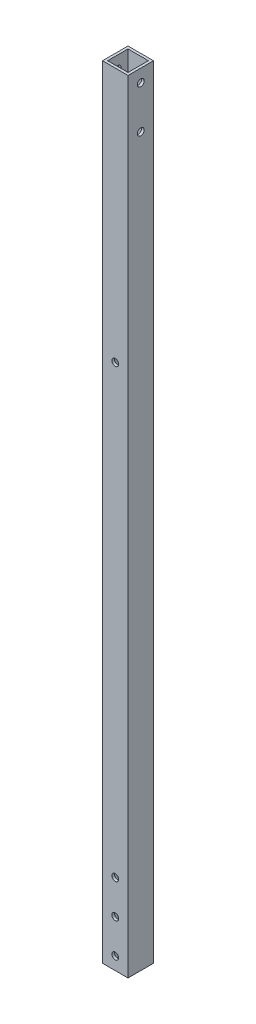
ISO-10303-21;
HEADER;
FILE_DESCRIPTION(('STEP AP214'),'2;1');
FILE_NAME('part.step','',(''),(''),'','','');
FILE_SCHEMA(('AUTOMOTIVE_DESIGN { 1 0 10303 214 1 1 1 1 }'));
ENDSEC;
DATA;
#1=APPLICATION_CONTEXT('core data for automotive mechanical design processes');
#2=APPLICATION_PROTOCOL_DEFINITION('international standard','automotive_design',2000,#1);
#3=PRODUCT_CONTEXT('',#1,'mechanical');
#4=PRODUCT('Part','Part','',(#3));
#5=PRODUCT_RELATED_PRODUCT_CATEGORY('part','',(#4));
#6=PRODUCT_DEFINITION_FORMATION('','',#4);
#7=PRODUCT_DEFINITION_CONTEXT('part definition',#1,'design');
#8=PRODUCT_DEFINITION('design','',#6,#7);
#9=PRODUCT_DEFINITION_SHAPE('','',#8);
#10=(LENGTH_UNIT() NAMED_UNIT(*) SI_UNIT(.MILLI.,.METRE.));
#11=(NAMED_UNIT(*) PLANE_ANGLE_UNIT() SI_UNIT($,.RADIAN.));
#12=(NAMED_UNIT(*) SI_UNIT($,.STERADIAN.) SOLID_ANGLE_UNIT());
#13=UNCERTAINTY_MEASURE_WITH_UNIT(LENGTH_MEASURE(1.E-05),#10,'distance_accuracy_value','');
#14=(GEOMETRIC_REPRESENTATION_CONTEXT(3) GLOBAL_UNCERTAINTY_ASSIGNED_CONTEXT((#13)) GLOBAL_UNIT_ASSIGNED_CONTEXT((#10,
#11,#12)) REPRESENTATION_CONTEXT('',''));
#15=CARTESIAN_POINT('',(0.,0.,0.));
#16=DIRECTION('',(0.,0.,1.));
#17=DIRECTION('',(1.,0.,0.));
#18=AXIS2_PLACEMENT_3D('',#15,#16,#17);
#19=CARTESIAN_POINT('',(0.,460.,0.));
#20=DIRECTION('',(0.,1.,0.));
#21=DIRECTION('',(0.,0.,1.));
#22=AXIS2_PLACEMENT_3D('',#19,#20,#21);
#23=PLANE('',#22);
#24=DIRECTION('',(0.,0.,-1.));
#25=VECTOR('',#24,1.);
#26=CARTESIAN_POINT('',(7.5,460.,7.5));
#27=LINE('',#26,#25);
#28=CARTESIAN_POINT('',(7.5,460.,7.5));
#29=VERTEX_POINT('',#28);
#30=CARTESIAN_POINT('',(7.5,460.,-7.5));
#31=VERTEX_POINT('',#30);
#32=EDGE_CURVE('E162',#29,#31,#27,.T.);
#33=ORIENTED_EDGE('',*,*,#32,.T.);
#34=DIRECTION('',(-1.,0.,0.));
#35=VECTOR('',#34,1.);
#36=CARTESIAN_POINT('',(-7.5,460.,-7.5));
#37=LINE('',#36,#35);
#38=CARTESIAN_POINT('',(-7.5,460.,-7.5));
#39=VERTEX_POINT('',#38);
#40=EDGE_CURVE('E165',#31,#39,#37,.T.);
#41=ORIENTED_EDGE('',*,*,#40,.T.);
#42=DIRECTION('',(0.,0.,1.));
#43=VECTOR('',#42,1.);
#44=CARTESIAN_POINT('',(-7.5,460.,7.5));
#45=LINE('',#44,#43);
#46=CARTESIAN_POINT('',(-7.5,460.,7.5));
#47=VERTEX_POINT('',#46);
#48=EDGE_CURVE('E168',#39,#47,#45,.T.);
#49=ORIENTED_EDGE('',*,*,#48,.T.);
#50=DIRECTION('',(1.,0.,0.));
#51=VECTOR('',#50,1.);
#52=CARTESIAN_POINT('',(-7.5,460.,7.5));
#53=LINE('',#52,#51);
#54=EDGE_CURVE('E170',#47,#29,#53,.T.);
#55=ORIENTED_EDGE('',*,*,#54,.T.);
#56=EDGE_LOOP('',(#33,#41,#49,#55));
#57=FACE_BOUND('',#56,.T.);
#58=DIRECTION('',(-1.,0.,0.));
#59=VECTOR('',#58,1.);
#60=CARTESIAN_POINT('',(0.,460.,-6.));
#61=LINE('',#60,#59);
#62=CARTESIAN_POINT('',(6.,460.,-6.));
#63=VERTEX_POINT('',#62);
#64=CARTESIAN_POINT('',(-6.,460.,-6.));
#65=VERTEX_POINT('',#64);
#66=EDGE_CURVE('E132',#63,#65,#61,.T.);
#67=ORIENTED_EDGE('',*,*,#66,.F.);
#68=DIRECTION('',(0.,0.,-1.));
#69=VECTOR('',#68,1.);
#70=CARTESIAN_POINT('',(6.,460.,0.));
#71=LINE('',#70,#69);
#72=CARTESIAN_POINT('',(6.,460.,6.));
#73=VERTEX_POINT('',#72);
#74=EDGE_CURVE('E124',#73,#63,#71,.T.);
#75=ORIENTED_EDGE('',*,*,#74,.F.);
#76=DIRECTION('',(1.,0.,0.));
#77=VECTOR('',#76,1.);
#78=CARTESIAN_POINT('',(0.,460.,6.));
#79=LINE('',#78,#77);
#80=CARTESIAN_POINT('',(-6.,460.,6.));
#81=VERTEX_POINT('',#80);
#82=EDGE_CURVE('E146',#81,#73,#79,.T.);
#83=ORIENTED_EDGE('',*,*,#82,.F.);
#84=DIRECTION('',(0.,0.,1.));
#85=VECTOR('',#84,1.);
#86=CARTESIAN_POINT('',(-6.,460.,0.));
#87=LINE('',#86,#85);
#88=EDGE_CURVE('E144',#65,#81,#87,.T.);
#89=ORIENTED_EDGE('',*,*,#88,.F.);
#90=EDGE_LOOP('',(#67,#75,#83,#89));
#91=FACE_BOUND('',#90,.T.);
#92=ADVANCED_FACE('F57',(#57,#91),#23,.T.);
#93=CARTESIAN_POINT('',(0.,0.,0.));
#94=DIRECTION('',(0.,1.,0.));
#95=DIRECTION('',(0.,0.,1.));
#96=AXIS2_PLACEMENT_3D('',#93,#94,#95);
#97=PLANE('',#96);
#98=DIRECTION('',(0.,0.,-1.));
#99=VECTOR('',#98,1.);
#100=CARTESIAN_POINT('',(7.5,0.,7.5));
#101=LINE('',#100,#99);
#102=CARTESIAN_POINT('',(7.5,0.,7.5));
#103=VERTEX_POINT('',#102);
#104=CARTESIAN_POINT('',(7.5,0.,-7.5));
#105=VERTEX_POINT('',#104);
#106=EDGE_CURVE('E140',#103,#105,#101,.T.);
#107=ORIENTED_EDGE('',*,*,#106,.F.);
#108=DIRECTION('',(1.,0.,0.));
#109=VECTOR('',#108,1.);
#110=CARTESIAN_POINT('',(-7.5,0.,7.5));
#111=LINE('',#110,#109);
#112=CARTESIAN_POINT('',(-7.5,0.,7.5));
#113=VERTEX_POINT('',#112);
#114=EDGE_CURVE('E166',#113,#103,#111,.T.);
#115=ORIENTED_EDGE('',*,*,#114,.F.);
#116=DIRECTION('',(0.,0.,1.));
#117=VECTOR('',#116,1.);
#118=CARTESIAN_POINT('',(-7.5,0.,7.5));
#119=LINE('',#118,#117);
#120=CARTESIAN_POINT('',(-7.5,0.,-7.5));
#121=VERTEX_POINT('',#120);
#122=EDGE_CURVE('E177',#121,#113,#119,.T.);
#123=ORIENTED_EDGE('',*,*,#122,.F.);
#124=DIRECTION('',(-1.,0.,0.));
#125=VECTOR('',#124,1.);
#126=CARTESIAN_POINT('',(-7.5,0.,-7.5));
#127=LINE('',#126,#125);
#128=EDGE_CURVE('E175',#105,#121,#127,.T.);
#129=ORIENTED_EDGE('',*,*,#128,.F.);
#130=EDGE_LOOP('',(#107,#115,#123,#129));
#131=FACE_BOUND('',#130,.T.);
#132=DIRECTION('',(0.,0.,-1.));
#133=VECTOR('',#132,1.);
#134=CARTESIAN_POINT('',(6.,0.,0.));
#135=LINE('',#134,#133);
#136=CARTESIAN_POINT('',(6.,0.,6.));
#137=VERTEX_POINT('',#136);
#138=CARTESIAN_POINT('',(6.,0.,-6.));
#139=VERTEX_POINT('',#138);
#140=EDGE_CURVE('E82',#137,#139,#135,.T.);
#141=ORIENTED_EDGE('',*,*,#140,.T.);
#142=DIRECTION('',(-1.,0.,0.));
#143=VECTOR('',#142,1.);
#144=CARTESIAN_POINT('',(0.,0.,-6.));
#145=LINE('',#144,#143);
#146=CARTESIAN_POINT('',(-6.,0.,-6.));
#147=VERTEX_POINT('',#146);
#148=EDGE_CURVE('E139',#139,#147,#145,.T.);
#149=ORIENTED_EDGE('',*,*,#148,.T.);
#150=DIRECTION('',(0.,0.,1.));
#151=VECTOR('',#150,1.);
#152=CARTESIAN_POINT('',(-6.,0.,0.));
#153=LINE('',#152,#151);
#154=CARTESIAN_POINT('',(-6.,0.,6.));
#155=VERTEX_POINT('',#154);
#156=EDGE_CURVE('E154',#147,#155,#153,.T.);
#157=ORIENTED_EDGE('',*,*,#156,.T.);
#158=DIRECTION('',(1.,0.,0.));
#159=VECTOR('',#158,1.);
#160=CARTESIAN_POINT('',(0.,0.,6.));
#161=LINE('',#160,#159);
#162=EDGE_CURVE('E133',#155,#137,#161,.T.);
#163=ORIENTED_EDGE('',*,*,#162,.T.);
#164=EDGE_LOOP('',(#141,#149,#157,#163));
#165=FACE_BOUND('',#164,.T.);
#166=ADVANCED_FACE('F255',(#131,#165),#97,.F.);
#167=CARTESIAN_POINT('',(7.5,460.,7.5));
#168=DIRECTION('',(-1.,0.,0.));
#169=DIRECTION('',(0.,0.,1.));
#170=AXIS2_PLACEMENT_3D('',#167,#168,#169);
#171=PLANE('',#170);
#172=CARTESIAN_POINT('',(7.5,452.5,0.));
#173=DIRECTION('',(1.,0.,0.));
#174=DIRECTION('',(0.,0.,-1.));
#175=AXIS2_PLACEMENT_3D('',#172,#173,#174);
#176=CIRCLE('',#175,2.);
#177=CARTESIAN_POINT('',(7.5,452.5,-2.));
#178=VERTEX_POINT('',#177);
#179=EDGE_CURVE('E223',#178,#178,#176,.T.);
#180=ORIENTED_EDGE('',*,*,#179,.F.);
#181=EDGE_LOOP('',(#180));
#182=FACE_BOUND('',#181,.T.);
#183=CARTESIAN_POINT('',(7.5,427.5,0.));
#184=DIRECTION('',(1.,0.,0.));
#185=DIRECTION('',(0.,0.,-1.));
#186=AXIS2_PLACEMENT_3D('',#183,#184,#185);
#187=CIRCLE('',#186,2.);
#188=CARTESIAN_POINT('',(7.5,427.5,-2.));
#189=VERTEX_POINT('',#188);
#190=EDGE_CURVE('E220',#189,#189,#187,.T.);
#191=ORIENTED_EDGE('',*,*,#190,.F.);
#192=EDGE_LOOP('',(#191));
#193=FACE_BOUND('',#192,.T.);
#194=ORIENTED_EDGE('',*,*,#106,.T.);
#195=DIRECTION('',(0.,-1.,0.));
#196=VECTOR('',#195,1.);
#197=CARTESIAN_POINT('',(7.5,460.,-7.5));
#198=LINE('',#197,#196);
#199=EDGE_CURVE('E12',#31,#105,#198,.T.);
#200=ORIENTED_EDGE('',*,*,#199,.F.);
#201=ORIENTED_EDGE('',*,*,#32,.F.);
#202=DIRECTION('',(0.,-1.,0.));
#203=VECTOR('',#202,1.);
#204=CARTESIAN_POINT('',(7.5,460.,7.5));
#205=LINE('',#204,#203);
#206=EDGE_CURVE('E172',#29,#103,#205,.T.);
#207=ORIENTED_EDGE('',*,*,#206,.T.);
#208=EDGE_LOOP('',(#194,#200,#201,#207));
#209=FACE_BOUND('',#208,.T.);
#210=ADVANCED_FACE('F59',(#182,#193,#209),#171,.F.);
#211=CARTESIAN_POINT('',(-7.5,460.,-7.5));
#212=DIRECTION('',(0.,0.,1.));
#213=DIRECTION('',(1.,0.,0.));
#214=AXIS2_PLACEMENT_3D('',#211,#212,#213);
#215=PLANE('',#214);
#216=CARTESIAN_POINT('',(0.,7.5,-7.5));
#217=DIRECTION('',(0.,0.,1.));
#218=DIRECTION('',(1.,0.,0.));
#219=AXIS2_PLACEMENT_3D('',#216,#217,#218);
#220=CIRCLE('',#219,2.);
#221=CARTESIAN_POINT('',(2.,7.5,-7.5));
#222=VERTEX_POINT('',#221);
#223=EDGE_CURVE('E199',#222,#222,#220,.T.);
#224=ORIENTED_EDGE('',*,*,#223,.T.);
#225=EDGE_LOOP('',(#224));
#226=FACE_BOUND('',#225,.T.);
#227=CARTESIAN_POINT('',(0.,47.5,-7.5));
#228=DIRECTION('',(0.,0.,1.));
#229=DIRECTION('',(1.,0.,0.));
#230=AXIS2_PLACEMENT_3D('',#227,#228,#229);
#231=CIRCLE('',#230,2.);
#232=CARTESIAN_POINT('',(2.,47.5,-7.5));
#233=VERTEX_POINT('',#232);
#234=EDGE_CURVE('E345',#233,#233,#231,.T.);
#235=ORIENTED_EDGE('',*,*,#234,.T.);
#236=EDGE_LOOP('',(#235));
#237=FACE_BOUND('',#236,.T.);
#238=CARTESIAN_POINT('',(0.,27.5,-7.5));
#239=DIRECTION('',(0.,0.,1.));
#240=DIRECTION('',(1.,0.,0.));
#241=AXIS2_PLACEMENT_3D('',#238,#239,#240);
#242=CIRCLE('',#241,2.);
#243=CARTESIAN_POINT('',(2.,27.5,-7.5));
#244=VERTEX_POINT('',#243);
#245=EDGE_CURVE('E353',#244,#244,#242,.T.);
#246=ORIENTED_EDGE('',*,*,#245,.T.);
#247=EDGE_LOOP('',(#246));
#248=FACE_BOUND('',#247,.T.);
#249=CARTESIAN_POINT('',(0.,310.,-7.5));
#250=DIRECTION('',(0.,0.,1.));
#251=DIRECTION('',(1.,0.,0.));
#252=AXIS2_PLACEMENT_3D('',#249,#250,#251);
#253=CIRCLE('',#252,2.);
#254=CARTESIAN_POINT('',(2.,310.,-7.5));
#255=VERTEX_POINT('',#254);
#256=EDGE_CURVE('E359',#255,#255,#253,.T.);
#257=ORIENTED_EDGE('',*,*,#256,.T.);
#258=EDGE_LOOP('',(#257));
#259=FACE_BOUND('',#258,.T.);
#260=ORIENTED_EDGE('',*,*,#128,.T.);
#261=DIRECTION('',(0.,-1.,0.));
#262=VECTOR('',#261,1.);
#263=CARTESIAN_POINT('',(-7.5,460.,-7.5));
#264=LINE('',#263,#262);
#265=EDGE_CURVE('E66',#39,#121,#264,.T.);
#266=ORIENTED_EDGE('',*,*,#265,.F.);
#267=ORIENTED_EDGE('',*,*,#40,.F.);
#268=ORIENTED_EDGE('',*,*,#199,.T.);
#269=EDGE_LOOP('',(#260,#266,#267,#268));
#270=FACE_BOUND('',#269,.T.);
#271=ADVANCED_FACE('F254',(#226,#237,#248,#259,#270),#215,.F.);
#272=CARTESIAN_POINT('',(-7.5,460.,7.5));
#273=DIRECTION('',(1.,0.,0.));
#274=DIRECTION('',(0.,0.,-1.));
#275=AXIS2_PLACEMENT_3D('',#272,#273,#274);
#276=PLANE('',#275);
#277=CARTESIAN_POINT('',(-7.5,452.5,0.));
#278=DIRECTION('',(1.,0.,0.));
#279=DIRECTION('',(0.,0.,-1.));
#280=AXIS2_PLACEMENT_3D('',#277,#278,#279);
#281=CIRCLE('',#280,2.);
#282=CARTESIAN_POINT('',(-7.5,452.5,-2.));
#283=VERTEX_POINT('',#282);
#284=EDGE_CURVE('E191',#283,#283,#281,.T.);
#285=ORIENTED_EDGE('',*,*,#284,.T.);
#286=EDGE_LOOP('',(#285));
#287=FACE_BOUND('',#286,.T.);
#288=CARTESIAN_POINT('',(-7.5,427.5,0.));
#289=DIRECTION('',(1.,0.,0.));
#290=DIRECTION('',(0.,0.,-1.));
#291=AXIS2_PLACEMENT_3D('',#288,#289,#290);
#292=CIRCLE('',#291,2.);
#293=CARTESIAN_POINT('',(-7.5,427.5,-2.));
#294=VERTEX_POINT('',#293);
#295=EDGE_CURVE('E226',#294,#294,#292,.T.);
#296=ORIENTED_EDGE('',*,*,#295,.T.);
#297=EDGE_LOOP('',(#296));
#298=FACE_BOUND('',#297,.T.);
#299=ORIENTED_EDGE('',*,*,#122,.T.);
#300=DIRECTION('',(0.,-1.,0.));
#301=VECTOR('',#300,1.);
#302=CARTESIAN_POINT('',(-7.5,460.,7.5));
#303=LINE('',#302,#301);
#304=EDGE_CURVE('E182',#47,#113,#303,.T.);
#305=ORIENTED_EDGE('',*,*,#304,.F.);
#306=ORIENTED_EDGE('',*,*,#48,.F.);
#307=ORIENTED_EDGE('',*,*,#265,.T.);
#308=EDGE_LOOP('',(#299,#305,#306,#307));
#309=FACE_BOUND('',#308,.T.);
#310=ADVANCED_FACE('F273',(#287,#298,#309),#276,.F.);
#311=CARTESIAN_POINT('',(-7.5,460.,7.5));
#312=DIRECTION('',(0.,0.,-1.));
#313=DIRECTION('',(-1.,0.,0.));
#314=AXIS2_PLACEMENT_3D('',#311,#312,#313);
#315=PLANE('',#314);
#316=CARTESIAN_POINT('',(0.,7.5,7.5));
#317=DIRECTION('',(0.,0.,1.));
#318=DIRECTION('',(1.,0.,0.));
#319=AXIS2_PLACEMENT_3D('',#316,#317,#318);
#320=CIRCLE('',#319,2.);
#321=CARTESIAN_POINT('',(2.,7.5,7.5));
#322=VERTEX_POINT('',#321);
#323=EDGE_CURVE('E342',#322,#322,#320,.T.);
#324=ORIENTED_EDGE('',*,*,#323,.F.);
#325=EDGE_LOOP('',(#324));
#326=FACE_BOUND('',#325,.T.);
#327=CARTESIAN_POINT('',(0.,47.5,7.5));
#328=DIRECTION('',(0.,0.,1.));
#329=DIRECTION('',(1.,0.,0.));
#330=AXIS2_PLACEMENT_3D('',#327,#328,#329);
#331=CIRCLE('',#330,2.);
#332=CARTESIAN_POINT('',(2.,47.5,7.5));
#333=VERTEX_POINT('',#332);
#334=EDGE_CURVE('E350',#333,#333,#331,.T.);
#335=ORIENTED_EDGE('',*,*,#334,.F.);
#336=EDGE_LOOP('',(#335));
#337=FACE_BOUND('',#336,.T.);
#338=CARTESIAN_POINT('',(0.,27.5,7.5));
#339=DIRECTION('',(0.,0.,1.));
#340=DIRECTION('',(1.,0.,0.));
#341=AXIS2_PLACEMENT_3D('',#338,#339,#340);
#342=CIRCLE('',#341,2.);
#343=CARTESIAN_POINT('',(2.,27.5,7.5));
#344=VERTEX_POINT('',#343);
#345=EDGE_CURVE('E356',#344,#344,#342,.T.);
#346=ORIENTED_EDGE('',*,*,#345,.F.);
#347=EDGE_LOOP('',(#346));
#348=FACE_BOUND('',#347,.T.);
#349=CARTESIAN_POINT('',(0.,310.,7.5));
#350=DIRECTION('',(0.,0.,1.));
#351=DIRECTION('',(1.,0.,0.));
#352=AXIS2_PLACEMENT_3D('',#349,#350,#351);
#353=CIRCLE('',#352,2.);
#354=CARTESIAN_POINT('',(2.,310.,7.5));
#355=VERTEX_POINT('',#354);
#356=EDGE_CURVE('E361',#355,#355,#353,.T.);
#357=ORIENTED_EDGE('',*,*,#356,.F.);
#358=EDGE_LOOP('',(#357));
#359=FACE_BOUND('',#358,.T.);
#360=ORIENTED_EDGE('',*,*,#114,.T.);
#361=ORIENTED_EDGE('',*,*,#206,.F.);
#362=ORIENTED_EDGE('',*,*,#54,.F.);
#363=ORIENTED_EDGE('',*,*,#304,.T.);
#364=EDGE_LOOP('',(#360,#361,#362,#363));
#365=FACE_BOUND('',#364,.T.);
#366=ADVANCED_FACE('F240',(#326,#337,#348,#359,#365),#315,.F.);
#367=CARTESIAN_POINT('',(6.,460.,0.));
#368=DIRECTION('',(-1.,0.,0.));
#369=DIRECTION('',(0.,0.,1.));
#370=AXIS2_PLACEMENT_3D('',#367,#368,#369);
#371=PLANE('',#370);
#372=CARTESIAN_POINT('',(6.,452.5,0.));
#373=DIRECTION('',(-1.,0.,0.));
#374=DIRECTION('',(0.,0.,1.));
#375=AXIS2_PLACEMENT_3D('',#372,#373,#374);
#376=CIRCLE('',#375,2.);
#377=CARTESIAN_POINT('',(6.,452.5,2.));
#378=VERTEX_POINT('',#377);
#379=EDGE_CURVE('E152',#378,#378,#376,.T.);
#380=ORIENTED_EDGE('',*,*,#379,.F.);
#381=EDGE_LOOP('',(#380));
#382=FACE_BOUND('',#381,.T.);
#383=CARTESIAN_POINT('',(6.,427.5,0.));
#384=DIRECTION('',(-1.,0.,0.));
#385=DIRECTION('',(0.,0.,1.));
#386=AXIS2_PLACEMENT_3D('',#383,#384,#385);
#387=CIRCLE('',#386,2.);
#388=CARTESIAN_POINT('',(6.,427.5,2.));
#389=VERTEX_POINT('',#388);
#390=EDGE_CURVE('E190',#389,#389,#387,.T.);
#391=ORIENTED_EDGE('',*,*,#390,.F.);
#392=EDGE_LOOP('',(#391));
#393=FACE_BOUND('',#392,.T.);
#394=ORIENTED_EDGE('',*,*,#140,.F.);
#395=DIRECTION('',(0.,-1.,0.));
#396=VECTOR('',#395,1.);
#397=CARTESIAN_POINT('',(6.,460.,6.));
#398=LINE('',#397,#396);
#399=EDGE_CURVE('E128',#73,#137,#398,.T.);
#400=ORIENTED_EDGE('',*,*,#399,.F.);
#401=ORIENTED_EDGE('',*,*,#74,.T.);
#402=DIRECTION('',(0.,-1.,0.));
#403=VECTOR('',#402,1.);
#404=CARTESIAN_POINT('',(6.,460.,-6.));
#405=LINE('',#404,#403);
#406=EDGE_CURVE('E127',#63,#139,#405,.T.);
#407=ORIENTED_EDGE('',*,*,#406,.T.);
#408=EDGE_LOOP('',(#394,#400,#401,#407));
#409=FACE_BOUND('',#408,.T.);
#410=ADVANCED_FACE('F126',(#382,#393,#409),#371,.T.);
#411=CARTESIAN_POINT('',(0.,460.,-6.));
#412=DIRECTION('',(0.,0.,1.));
#413=DIRECTION('',(1.,0.,0.));
#414=AXIS2_PLACEMENT_3D('',#411,#412,#413);
#415=PLANE('',#414);
#416=CARTESIAN_POINT('',(0.,7.5,-6.));
#417=DIRECTION('',(0.,0.,1.));
#418=DIRECTION('',(1.,0.,0.));
#419=AXIS2_PLACEMENT_3D('',#416,#417,#418);
#420=CIRCLE('',#419,2.);
#421=CARTESIAN_POINT('',(2.,7.5,-6.));
#422=VERTEX_POINT('',#421);
#423=EDGE_CURVE('E217',#422,#422,#420,.T.);
#424=ORIENTED_EDGE('',*,*,#423,.F.);
#425=EDGE_LOOP('',(#424));
#426=FACE_BOUND('',#425,.T.);
#427=CARTESIAN_POINT('',(0.,47.5,-6.));
#428=DIRECTION('',(0.,0.,1.));
#429=DIRECTION('',(1.,0.,0.));
#430=AXIS2_PLACEMENT_3D('',#427,#428,#429);
#431=CIRCLE('',#430,2.);
#432=CARTESIAN_POINT('',(2.,47.5,-6.));
#433=VERTEX_POINT('',#432);
#434=EDGE_CURVE('E205',#433,#433,#431,.T.);
#435=ORIENTED_EDGE('',*,*,#434,.F.);
#436=EDGE_LOOP('',(#435));
#437=FACE_BOUND('',#436,.T.);
#438=CARTESIAN_POINT('',(0.,27.5,-6.));
#439=DIRECTION('',(0.,0.,1.));
#440=DIRECTION('',(1.,0.,0.));
#441=AXIS2_PLACEMENT_3D('',#438,#439,#440);
#442=CIRCLE('',#441,2.);
#443=CARTESIAN_POINT('',(2.,27.5,-6.));
#444=VERTEX_POINT('',#443);
#445=EDGE_CURVE('E202',#444,#444,#442,.T.);
#446=ORIENTED_EDGE('',*,*,#445,.F.);
#447=EDGE_LOOP('',(#446));
#448=FACE_BOUND('',#447,.T.);
#449=CARTESIAN_POINT('',(0.,310.,-6.));
#450=DIRECTION('',(0.,0.,1.));
#451=DIRECTION('',(1.,0.,0.));
#452=AXIS2_PLACEMENT_3D('',#449,#450,#451);
#453=CIRCLE('',#452,2.);
#454=CARTESIAN_POINT('',(2.,310.,-6.));
#455=VERTEX_POINT('',#454);
#456=EDGE_CURVE('E198',#455,#455,#453,.T.);
#457=ORIENTED_EDGE('',*,*,#456,.F.);
#458=EDGE_LOOP('',(#457));
#459=FACE_BOUND('',#458,.T.);
#460=ORIENTED_EDGE('',*,*,#148,.F.);
#461=ORIENTED_EDGE('',*,*,#406,.F.);
#462=ORIENTED_EDGE('',*,*,#66,.T.);
#463=DIRECTION('',(0.,-1.,0.));
#464=VECTOR('',#463,1.);
#465=CARTESIAN_POINT('',(-6.,460.,-6.));
#466=LINE('',#465,#464);
#467=EDGE_CURVE('E141',#65,#147,#466,.T.);
#468=ORIENTED_EDGE('',*,*,#467,.T.);
#469=EDGE_LOOP('',(#460,#461,#462,#468));
#470=FACE_BOUND('',#469,.T.);
#471=ADVANCED_FACE('F136',(#426,#437,#448,#459,#470),#415,.T.);
#472=CARTESIAN_POINT('',(-6.,460.,0.));
#473=DIRECTION('',(1.,0.,0.));
#474=DIRECTION('',(0.,0.,-1.));
#475=AXIS2_PLACEMENT_3D('',#472,#473,#474);
#476=PLANE('',#475);
#477=CARTESIAN_POINT('',(-6.,452.5,0.));
#478=DIRECTION('',(1.,0.,0.));
#479=DIRECTION('',(0.,0.,-1.));
#480=AXIS2_PLACEMENT_3D('',#477,#478,#479);
#481=CIRCLE('',#480,2.);
#482=CARTESIAN_POINT('',(-6.,452.5,-2.));
#483=VERTEX_POINT('',#482);
#484=EDGE_CURVE('E192',#483,#483,#481,.T.);
#485=ORIENTED_EDGE('',*,*,#484,.F.);
#486=EDGE_LOOP('',(#485));
#487=FACE_BOUND('',#486,.T.);
#488=CARTESIAN_POINT('',(-6.,427.5,0.));
#489=DIRECTION('',(1.,0.,0.));
#490=DIRECTION('',(0.,0.,-1.));
#491=AXIS2_PLACEMENT_3D('',#488,#489,#490);
#492=CIRCLE('',#491,2.);
#493=CARTESIAN_POINT('',(-6.,427.5,-2.));
#494=VERTEX_POINT('',#493);
#495=EDGE_CURVE('E187',#494,#494,#492,.T.);
#496=ORIENTED_EDGE('',*,*,#495,.F.);
#497=EDGE_LOOP('',(#496));
#498=FACE_BOUND('',#497,.T.);
#499=ORIENTED_EDGE('',*,*,#156,.F.);
#500=ORIENTED_EDGE('',*,*,#467,.F.);
#501=ORIENTED_EDGE('',*,*,#88,.T.);
#502=DIRECTION('',(0.,-1.,0.));
#503=VECTOR('',#502,1.);
#504=CARTESIAN_POINT('',(-6.,460.,6.));
#505=LINE('',#504,#503);
#506=EDGE_CURVE('E74',#81,#155,#505,.T.);
#507=ORIENTED_EDGE('',*,*,#506,.T.);
#508=EDGE_LOOP('',(#499,#500,#501,#507));
#509=FACE_BOUND('',#508,.T.);
#510=ADVANCED_FACE('F294',(#487,#498,#509),#476,.T.);
#511=CARTESIAN_POINT('',(0.,460.,6.));
#512=DIRECTION('',(0.,0.,-1.));
#513=DIRECTION('',(-1.,0.,0.));
#514=AXIS2_PLACEMENT_3D('',#511,#512,#513);
#515=PLANE('',#514);
#516=CARTESIAN_POINT('',(0.,7.5,6.));
#517=DIRECTION('',(0.,0.,-1.));
#518=DIRECTION('',(-1.,0.,0.));
#519=AXIS2_PLACEMENT_3D('',#516,#517,#518);
#520=CIRCLE('',#519,2.);
#521=CARTESIAN_POINT('',(-2.,7.5,6.));
#522=VERTEX_POINT('',#521);
#523=EDGE_CURVE('E61',#522,#522,#520,.T.);
#524=ORIENTED_EDGE('',*,*,#523,.F.);
#525=EDGE_LOOP('',(#524));
#526=FACE_BOUND('',#525,.T.);
#527=CARTESIAN_POINT('',(0.,47.5,6.));
#528=DIRECTION('',(0.,0.,-1.));
#529=DIRECTION('',(-1.,0.,0.));
#530=AXIS2_PLACEMENT_3D('',#527,#528,#529);
#531=CIRCLE('',#530,2.);
#532=CARTESIAN_POINT('',(-2.,47.5,6.));
#533=VERTEX_POINT('',#532);
#534=EDGE_CURVE('E203',#533,#533,#531,.T.);
#535=ORIENTED_EDGE('',*,*,#534,.F.);
#536=EDGE_LOOP('',(#535));
#537=FACE_BOUND('',#536,.T.);
#538=CARTESIAN_POINT('',(0.,27.5,6.));
#539=DIRECTION('',(0.,0.,-1.));
#540=DIRECTION('',(-1.,0.,0.));
#541=AXIS2_PLACEMENT_3D('',#538,#539,#540);
#542=CIRCLE('',#541,2.);
#543=CARTESIAN_POINT('',(-2.,27.5,6.));
#544=VERTEX_POINT('',#543);
#545=EDGE_CURVE('E200',#544,#544,#542,.T.);
#546=ORIENTED_EDGE('',*,*,#545,.F.);
#547=EDGE_LOOP('',(#546));
#548=FACE_BOUND('',#547,.T.);
#549=CARTESIAN_POINT('',(0.,310.,6.));
#550=DIRECTION('',(0.,0.,-1.));
#551=DIRECTION('',(-1.,0.,0.));
#552=AXIS2_PLACEMENT_3D('',#549,#550,#551);
#553=CIRCLE('',#552,2.);
#554=CARTESIAN_POINT('',(-2.,310.,6.));
#555=VERTEX_POINT('',#554);
#556=EDGE_CURVE('E195',#555,#555,#553,.T.);
#557=ORIENTED_EDGE('',*,*,#556,.F.);
#558=EDGE_LOOP('',(#557));
#559=FACE_BOUND('',#558,.T.);
#560=ORIENTED_EDGE('',*,*,#162,.F.);
#561=ORIENTED_EDGE('',*,*,#506,.F.);
#562=ORIENTED_EDGE('',*,*,#82,.T.);
#563=ORIENTED_EDGE('',*,*,#399,.T.);
#564=EDGE_LOOP('',(#560,#561,#562,#563));
#565=FACE_BOUND('',#564,.T.);
#566=ADVANCED_FACE('F298',(#526,#537,#548,#559,#565),#515,.T.);
#567=CARTESIAN_POINT('',(-7.5,427.5,0.));
#568=DIRECTION('',(1.,0.,0.));
#569=DIRECTION('',(0.,0.,-1.));
#570=AXIS2_PLACEMENT_3D('',#567,#568,#569);
#571=CYLINDRICAL_SURFACE('',#570,2.);
#572=ORIENTED_EDGE('',*,*,#495,.T.);
#573=EDGE_LOOP('',(#572));
#574=FACE_BOUND('',#573,.T.);
#575=ORIENTED_EDGE('',*,*,#295,.F.);
#576=EDGE_LOOP('',(#575));
#577=FACE_BOUND('',#576,.T.);
#578=ADVANCED_FACE('F249',(#574,#577),#571,.F.);
#579=CARTESIAN_POINT('',(-7.5,452.5,0.));
#580=DIRECTION('',(1.,0.,0.));
#581=DIRECTION('',(0.,0.,-1.));
#582=AXIS2_PLACEMENT_3D('',#579,#580,#581);
#583=CYLINDRICAL_SURFACE('',#582,2.);
#584=ORIENTED_EDGE('',*,*,#484,.T.);
#585=EDGE_LOOP('',(#584));
#586=FACE_BOUND('',#585,.T.);
#587=ORIENTED_EDGE('',*,*,#284,.F.);
#588=EDGE_LOOP('',(#587));
#589=FACE_BOUND('',#588,.T.);
#590=ADVANCED_FACE('F247',(#586,#589),#583,.F.);
#591=ORIENTED_EDGE('',*,*,#390,.T.);
#592=EDGE_LOOP('',(#591));
#593=FACE_BOUND('',#592,.T.);
#594=ORIENTED_EDGE('',*,*,#190,.T.);
#595=EDGE_LOOP('',(#594));
#596=FACE_BOUND('',#595,.T.);
#597=ADVANCED_FACE('F244',(#593,#596),#571,.F.);
#598=ORIENTED_EDGE('',*,*,#379,.T.);
#599=EDGE_LOOP('',(#598));
#600=FACE_BOUND('',#599,.T.);
#601=ORIENTED_EDGE('',*,*,#179,.T.);
#602=EDGE_LOOP('',(#601));
#603=FACE_BOUND('',#602,.T.);
#604=ADVANCED_FACE('F235',(#600,#603),#583,.F.);
#605=CARTESIAN_POINT('',(0.,310.,-7.5));
#606=DIRECTION('',(0.,0.,1.));
#607=DIRECTION('',(1.,0.,0.));
#608=AXIS2_PLACEMENT_3D('',#605,#606,#607);
#609=CYLINDRICAL_SURFACE('',#608,2.);
#610=ORIENTED_EDGE('',*,*,#556,.T.);
#611=EDGE_LOOP('',(#610));
#612=FACE_BOUND('',#611,.T.);
#613=ORIENTED_EDGE('',*,*,#356,.T.);
#614=EDGE_LOOP('',(#613));
#615=FACE_BOUND('',#614,.T.);
#616=ADVANCED_FACE('F308',(#612,#615),#609,.F.);
#617=CARTESIAN_POINT('',(0.,27.5,-7.5));
#618=DIRECTION('',(0.,0.,1.));
#619=DIRECTION('',(1.,0.,0.));
#620=AXIS2_PLACEMENT_3D('',#617,#618,#619);
#621=CYLINDRICAL_SURFACE('',#620,2.);
#622=ORIENTED_EDGE('',*,*,#545,.T.);
#623=EDGE_LOOP('',(#622));
#624=FACE_BOUND('',#623,.T.);
#625=ORIENTED_EDGE('',*,*,#345,.T.);
#626=EDGE_LOOP('',(#625));
#627=FACE_BOUND('',#626,.T.);
#628=ADVANCED_FACE('F311',(#624,#627),#621,.F.);
#629=CARTESIAN_POINT('',(0.,47.5,-7.5));
#630=DIRECTION('',(0.,0.,1.));
#631=DIRECTION('',(1.,0.,0.));
#632=AXIS2_PLACEMENT_3D('',#629,#630,#631);
#633=CYLINDRICAL_SURFACE('',#632,2.);
#634=ORIENTED_EDGE('',*,*,#534,.T.);
#635=EDGE_LOOP('',(#634));
#636=FACE_BOUND('',#635,.T.);
#637=ORIENTED_EDGE('',*,*,#334,.T.);
#638=EDGE_LOOP('',(#637));
#639=FACE_BOUND('',#638,.T.);
#640=ADVANCED_FACE('F316',(#636,#639),#633,.F.);
#641=CARTESIAN_POINT('',(0.,7.5,-7.5));
#642=DIRECTION('',(0.,0.,1.));
#643=DIRECTION('',(1.,0.,0.));
#644=AXIS2_PLACEMENT_3D('',#641,#642,#643);
#645=CYLINDRICAL_SURFACE('',#644,2.);
#646=ORIENTED_EDGE('',*,*,#523,.T.);
#647=EDGE_LOOP('',(#646));
#648=FACE_BOUND('',#647,.T.);
#649=ORIENTED_EDGE('',*,*,#323,.T.);
#650=EDGE_LOOP('',(#649));
#651=FACE_BOUND('',#650,.T.);
#652=ADVANCED_FACE('F321',(#648,#651),#645,.F.);
#653=ORIENTED_EDGE('',*,*,#456,.T.);
#654=EDGE_LOOP('',(#653));
#655=FACE_BOUND('',#654,.T.);
#656=ORIENTED_EDGE('',*,*,#256,.F.);
#657=EDGE_LOOP('',(#656));
#658=FACE_BOUND('',#657,.T.);
#659=ADVANCED_FACE('F313',(#655,#658),#609,.F.);
#660=ORIENTED_EDGE('',*,*,#445,.T.);
#661=EDGE_LOOP('',(#660));
#662=FACE_BOUND('',#661,.T.);
#663=ORIENTED_EDGE('',*,*,#245,.F.);
#664=EDGE_LOOP('',(#663));
#665=FACE_BOUND('',#664,.T.);
#666=ADVANCED_FACE('F318',(#662,#665),#621,.F.);
#667=ORIENTED_EDGE('',*,*,#434,.T.);
#668=EDGE_LOOP('',(#667));
#669=FACE_BOUND('',#668,.T.);
#670=ORIENTED_EDGE('',*,*,#234,.F.);
#671=EDGE_LOOP('',(#670));
#672=FACE_BOUND('',#671,.T.);
#673=ADVANCED_FACE('F322',(#669,#672),#633,.F.);
#674=ORIENTED_EDGE('',*,*,#423,.T.);
#675=EDGE_LOOP('',(#674));
#676=FACE_BOUND('',#675,.T.);
#677=ORIENTED_EDGE('',*,*,#223,.F.);
#678=EDGE_LOOP('',(#677));
#679=FACE_BOUND('',#678,.T.);
#680=ADVANCED_FACE('F325',(#676,#679),#645,.F.);
#681=CLOSED_SHELL('',(#92,#166,#210,#271,#310,#366,#410,#471,#510,#566,#578,#590,#597,#604,#616,
#628,#640,#652,#659,#666,#673,#680));
#682=MANIFOLD_SOLID_BREP('B2',#681);
#683=ADVANCED_BREP_SHAPE_REPRESENTATION('',(#18,#682),#14);
#684=SHAPE_DEFINITION_REPRESENTATION(#9,#683);
ENDSEC;
END-ISO-10303-21;
